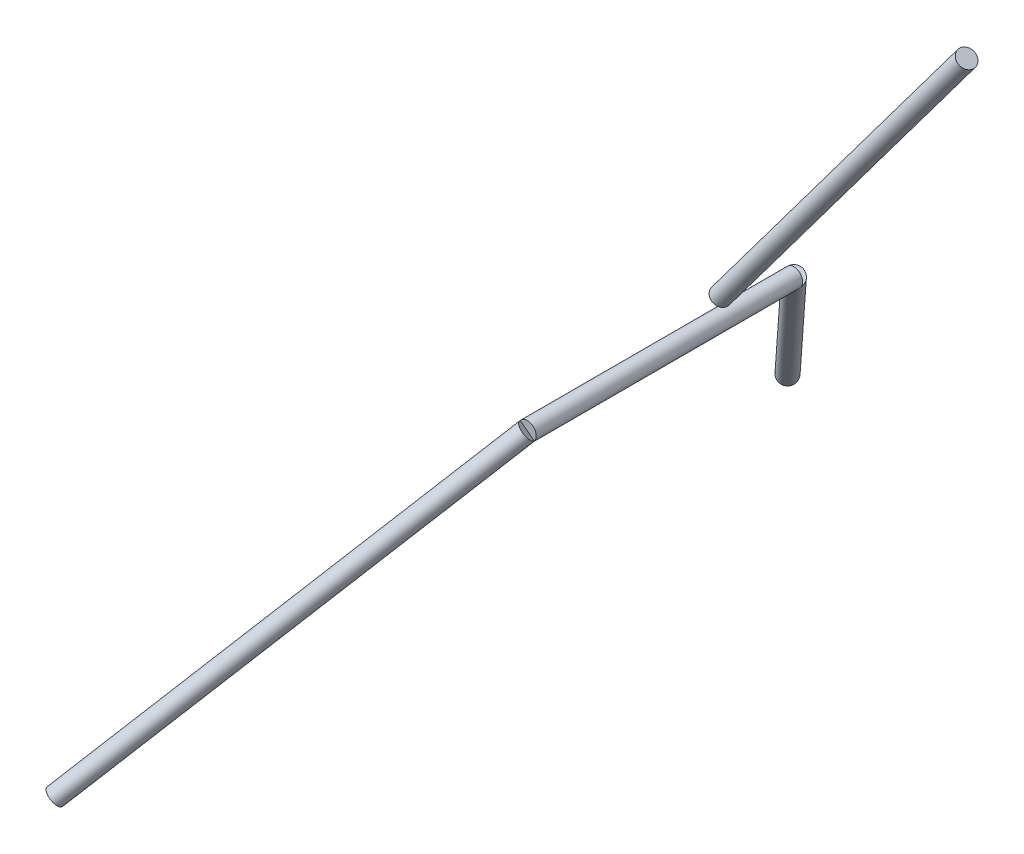
ISO-10303-21;
HEADER;
FILE_DESCRIPTION(('STEP AP214'),'2;1');
FILE_NAME('part.step','',(''),(''),'','','');
FILE_SCHEMA(('AUTOMOTIVE_DESIGN { 1 0 10303 214 1 1 1 1 }'));
ENDSEC;
DATA;
#1=APPLICATION_CONTEXT('core data for automotive mechanical design processes');
#2=APPLICATION_PROTOCOL_DEFINITION('international standard','automotive_design',2000,#1);
#3=PRODUCT_CONTEXT('',#1,'mechanical');
#4=PRODUCT('Part','Part','',(#3));
#5=PRODUCT_RELATED_PRODUCT_CATEGORY('part','',(#4));
#6=PRODUCT_DEFINITION_FORMATION('','',#4);
#7=PRODUCT_DEFINITION_CONTEXT('part definition',#1,'design');
#8=PRODUCT_DEFINITION('design','',#6,#7);
#9=PRODUCT_DEFINITION_SHAPE('','',#8);
#10=(LENGTH_UNIT() NAMED_UNIT(*) SI_UNIT(.MILLI.,.METRE.));
#11=(NAMED_UNIT(*) PLANE_ANGLE_UNIT() SI_UNIT($,.RADIAN.));
#12=(NAMED_UNIT(*) SI_UNIT($,.STERADIAN.) SOLID_ANGLE_UNIT());
#13=UNCERTAINTY_MEASURE_WITH_UNIT(LENGTH_MEASURE(1.E-05),#10,'distance_accuracy_value','');
#14=(GEOMETRIC_REPRESENTATION_CONTEXT(3) GLOBAL_UNCERTAINTY_ASSIGNED_CONTEXT((#13)) GLOBAL_UNIT_ASSIGNED_CONTEXT((#10,
#11,#12)) REPRESENTATION_CONTEXT('',''));
#15=CARTESIAN_POINT('',(0.,0.,0.));
#16=DIRECTION('',(0.,0.,1.));
#17=DIRECTION('',(1.,0.,0.));
#18=AXIS2_PLACEMENT_3D('',#15,#16,#17);
#19=CARTESIAN_POINT('',(-192.431415217252,410.982106119945,0.));
#20=DIRECTION('',(0.599126640950296,0.800654275017385,0.));
#21=DIRECTION('',(-0.800654275017385,0.599126640950296,0.));
#22=AXIS2_PLACEMENT_3D('',#19,#20,#21);
#23=PLANE('',#22);
#24=CARTESIAN_POINT('',(-192.431415217252,410.982106119945,0.));
#25=DIRECTION('',(0.599126640950296,0.800654275017385,0.));
#26=DIRECTION('',(-0.800654275017385,0.599126640950296,0.));
#27=AXIS2_PLACEMENT_3D('',#24,#25,#26);
#28=CIRCLE('',#27,0.800000000000014);
#29=CARTESIAN_POINT('',(-193.071938637266,411.461407432706,0.));
#30=VERTEX_POINT('',#29);
#31=EDGE_CURVE('E73',#30,#30,#28,.T.);
#32=ORIENTED_EDGE('',*,*,#31,.F.);
#33=EDGE_LOOP('',(#32));
#34=FACE_BOUND('',#33,.T.);
#35=ADVANCED_FACE('F67',(#34),#23,.F.);
#36=CARTESIAN_POINT('',(-170.263729502091,440.606314295589,0.));
#37=DIRECTION('',(0.599126640950296,0.800654275017385,0.));
#38=DIRECTION('',(-0.800654275017385,0.599126640950296,0.));
#39=AXIS2_PLACEMENT_3D('',#36,#37,#38);
#40=PLANE('',#39);
#41=CARTESIAN_POINT('',(-170.263729502091,440.606314295589,0.));
#42=DIRECTION('',(0.599126640950296,0.800654275017385,0.));
#43=DIRECTION('',(-0.800654275017385,0.599126640950296,0.));
#44=AXIS2_PLACEMENT_3D('',#41,#42,#43);
#45=CIRCLE('',#44,0.800000000000014);
#46=CARTESIAN_POINT('',(-170.904252922105,441.085615608349,0.));
#47=VERTEX_POINT('',#46);
#48=EDGE_CURVE('E12',#47,#47,#45,.T.);
#49=ORIENTED_EDGE('',*,*,#48,.T.);
#50=EDGE_LOOP('',(#49));
#51=FACE_BOUND('',#50,.T.);
#52=ADVANCED_FACE('F82',(#51),#40,.T.);
#53=CARTESIAN_POINT('',(-192.431415217252,410.982106119945,0.));
#54=DIRECTION('',(0.599126640950297,0.800654275017384,0.));
#55=DIRECTION('',(-0.800654275017384,0.599126640950297,0.));
#56=AXIS2_PLACEMENT_3D('',#53,#54,#55);
#57=CYLINDRICAL_SURFACE('',#56,0.800000000000014);
#58=ORIENTED_EDGE('',*,*,#48,.F.);
#59=EDGE_LOOP('',(#58));
#60=FACE_BOUND('',#59,.T.);
#61=ORIENTED_EDGE('',*,*,#31,.T.);
#62=EDGE_LOOP('',(#61));
#63=FACE_BOUND('',#62,.T.);
#64=ADVANCED_FACE('F79',(#60,#63),#57,.T.);
#65=CLOSED_SHELL('',(#35,#52,#64));
#66=MANIFOLD_SOLID_BREP('B2',#65);
#67=CARTESIAN_POINT('',(-197.823554985804,403.776217644789,12.));
#68=DIRECTION('',(0.,0.,1.));
#69=DIRECTION('',(1.,0.,0.));
#70=AXIS2_PLACEMENT_3D('',#67,#68,#69);
#71=PLANE('',#70);
#72=CARTESIAN_POINT('',(-197.823554985804,403.776217644789,12.));
#73=DIRECTION('',(0.,0.,1.));
#74=DIRECTION('',(1.,0.,0.));
#75=AXIS2_PLACEMENT_3D('',#72,#73,#74);
#76=CIRCLE('',#75,0.799999999999995);
#77=CARTESIAN_POINT('',(-197.183031565791,403.296916332029,11.9999999999999));
#78=VERTEX_POINT('',#77);
#79=CARTESIAN_POINT('',(-198.464078405818,404.255518957549,12.));
#80=VERTEX_POINT('',#79);
#81=EDGE_CURVE('E131',#78,#80,#76,.T.);
#82=ORIENTED_EDGE('',*,*,#81,.T.);
#83=DIRECTION('',(0.800654275017383,-0.599126640950299,0.));
#84=VECTOR('',#83,1.);
#85=CARTESIAN_POINT('',(-197.823554985804,403.776217644789,12.));
#86=LINE('',#85,#84);
#87=EDGE_CURVE('E140',#80,#78,#86,.T.);
#88=ORIENTED_EDGE('',*,*,#87,.T.);
#89=EDGE_LOOP('',(#82,#88));
#90=FACE_BOUND('',#89,.T.);
#91=ADVANCED_FACE('F108',(#90),#71,.T.);
#92=CARTESIAN_POINT('',(-197.823554985804,403.776217644789,-11.9999999999999));
#93=DIRECTION('',(0.517512951419017,0.69158826967415,0.503871025524086));
#94=DIRECTION('',(-0.800654275017386,0.599126640950295,0.));
#95=AXIS2_PLACEMENT_3D('',#92,#93,#94);
#96=PLANE('',#95);
#97=CARTESIAN_POINT('',(-197.823554985804,403.776217644789,-11.9999999999999));
#98=DIRECTION('',(0.517512951419017,0.69158826967415,0.503871025524086));
#99=DIRECTION('',(-0.800654275017386,0.599126640950295,0.));
#100=AXIS2_PLACEMENT_3D('',#97,#98,#99);
#101=CIRCLE('',#100,0.80000000000002);
#102=CARTESIAN_POINT('',(-197.183031565791,403.296916332029,-12.));
#103=VERTEX_POINT('',#102);
#104=CARTESIAN_POINT('',(-198.464078405818,404.255518957549,-12.));
#105=VERTEX_POINT('',#104);
#106=EDGE_CURVE('E161',#103,#105,#101,.T.);
#107=ORIENTED_EDGE('',*,*,#106,.T.);
#108=DIRECTION('',(0.800654275017386,-0.599126640950295,0.));
#109=VECTOR('',#108,1.);
#110=CARTESIAN_POINT('',(-197.823554985804,403.776217644789,-11.9999999999999));
#111=LINE('',#110,#109);
#112=EDGE_CURVE('E137',#105,#103,#111,.T.);
#113=ORIENTED_EDGE('',*,*,#112,.T.);
#114=EDGE_LOOP('',(#107,#113));
#115=FACE_BOUND('',#114,.T.);
#116=ADVANCED_FACE('F167',(#115),#96,.T.);
#117=CARTESIAN_POINT('',(-219.392114060015,374.952663744163,-33.));
#118=DIRECTION('',(0.517512951419017,0.69158826967415,0.503871025524086));
#119=DIRECTION('',(-0.800654275017386,0.599126640950295,0.));
#120=AXIS2_PLACEMENT_3D('',#117,#118,#119);
#121=PLANE('',#120);
#122=CARTESIAN_POINT('',(-219.392114060015,374.952663744163,-33.));
#123=DIRECTION('',(0.517512951419017,0.69158826967415,0.503871025524086));
#124=DIRECTION('',(-0.800654275017386,0.599126640950295,0.));
#125=AXIS2_PLACEMENT_3D('',#122,#123,#124);
#126=CIRCLE('',#125,0.80000000000002);
#127=CARTESIAN_POINT('',(-220.032637480029,375.431965056923,-33.));
#128=VERTEX_POINT('',#127);
#129=EDGE_CURVE('E158',#128,#128,#126,.T.);
#130=ORIENTED_EDGE('',*,*,#129,.F.);
#131=EDGE_LOOP('',(#130));
#132=FACE_BOUND('',#131,.T.);
#133=ADVANCED_FACE('F110',(#132),#121,.F.);
#134=CARTESIAN_POINT('',(-219.392114060015,374.952663744163,-33.));
#135=DIRECTION('',(0.517512951419018,0.691588269674149,0.503871025524086));
#136=DIRECTION('',(-0.800654275017385,0.599126640950296,0.));
#137=AXIS2_PLACEMENT_3D('',#134,#135,#136);
#138=CYLINDRICAL_SURFACE('',#137,0.80000000000002);
#139=CARTESIAN_POINT('',(-197.823554985804,403.776217644789,-11.9999999999999));
#140=DIRECTION('',(0.298401450030895,0.398774449855324,0.867142152569025));
#141=DIRECTION('',(0.51952796509509,0.694281071502168,-0.498060726456079));
#142=AXIS2_PLACEMENT_3D('',#139,#140,#141);
#143=ELLIPSE('',#142,0.922570766084776,0.800000000000008);
#144=EDGE_CURVE('E116',#105,#103,#143,.T.);
#145=ORIENTED_EDGE('',*,*,#144,.F.);
#146=ORIENTED_EDGE('',*,*,#106,.F.);
#147=EDGE_LOOP('',(#145,#146));
#148=FACE_BOUND('',#147,.T.);
#149=ORIENTED_EDGE('',*,*,#129,.T.);
#150=EDGE_LOOP('',(#149));
#151=FACE_BOUND('',#150,.T.);
#152=ADVANCED_FACE('F168',(#148,#151),#138,.T.);
#153=CARTESIAN_POINT('',(-197.823554985804,403.776217644789,-12.));
#154=DIRECTION('',(0.,0.,1.));
#155=DIRECTION('',(1.,0.,0.));
#156=AXIS2_PLACEMENT_3D('',#153,#154,#155);
#157=PLANE('',#156);
#158=ORIENTED_EDGE('',*,*,#112,.F.);
#159=CARTESIAN_POINT('',(-197.823554985804,403.776217644789,-12.));
#160=DIRECTION('',(0.,0.,1.));
#161=DIRECTION('',(1.,0.,0.));
#162=AXIS2_PLACEMENT_3D('',#159,#160,#161);
#163=CIRCLE('',#162,0.799999999999995);
#164=EDGE_CURVE('E138',#103,#105,#163,.T.);
#165=ORIENTED_EDGE('',*,*,#164,.F.);
#166=EDGE_LOOP('',(#158,#165));
#167=FACE_BOUND('',#166,.T.);
#168=ADVANCED_FACE('F165',(#167),#157,.F.);
#169=CARTESIAN_POINT('',(-197.823554985804,403.776217644789,-12.));
#170=DIRECTION('',(0.,0.,1.));
#171=DIRECTION('',(1.,0.,0.));
#172=AXIS2_PLACEMENT_3D('',#169,#170,#171);
#173=CYLINDRICAL_SURFACE('',#172,0.799999999999995);
#174=CARTESIAN_POINT('',(-197.823554985804,403.776217644789,12.));
#175=DIRECTION('',(-0.298401450030895,-0.398774449855324,0.867142152569025));
#176=DIRECTION('',(0.51952796509509,0.694281071502168,0.498060726456079));
#177=AXIS2_PLACEMENT_3D('',#174,#175,#176);
#178=ELLIPSE('',#177,0.922570766084777,0.800000000000008);
#179=EDGE_CURVE('E65',#80,#78,#178,.T.);
#180=ORIENTED_EDGE('',*,*,#179,.F.);
#181=ORIENTED_EDGE('',*,*,#81,.F.);
#182=EDGE_LOOP('',(#180,#181));
#183=FACE_BOUND('',#182,.T.);
#184=ORIENTED_EDGE('',*,*,#164,.T.);
#185=ORIENTED_EDGE('',*,*,#144,.T.);
#186=EDGE_LOOP('',(#184,#185));
#187=FACE_BOUND('',#186,.T.);
#188=ADVANCED_FACE('F133',(#183,#187),#173,.T.);
#189=CARTESIAN_POINT('',(-197.823554985804,403.776217644789,12.));
#190=DIRECTION('',(-0.51751295141902,-0.691588269674147,0.503871025524087));
#191=DIRECTION('',(0.800654275017383,-0.599126640950299,0.));
#192=AXIS2_PLACEMENT_3D('',#189,#190,#191);
#193=PLANE('',#192);
#194=ORIENTED_EDGE('',*,*,#87,.F.);
#195=CARTESIAN_POINT('',(-197.823554985804,403.776217644789,12.));
#196=DIRECTION('',(-0.51751295141902,-0.691588269674147,0.503871025524087));
#197=DIRECTION('',(0.800654275017383,-0.599126640950299,0.));
#198=AXIS2_PLACEMENT_3D('',#195,#196,#197);
#199=CIRCLE('',#198,0.800000000000022);
#200=EDGE_CURVE('E148',#78,#80,#199,.T.);
#201=ORIENTED_EDGE('',*,*,#200,.F.);
#202=EDGE_LOOP('',(#194,#201));
#203=FACE_BOUND('',#202,.T.);
#204=ADVANCED_FACE('F149',(#203),#193,.F.);
#205=CARTESIAN_POINT('',(-219.392114060015,374.952663744163,33.));
#206=DIRECTION('',(-0.51751295141902,-0.691588269674147,0.503871025524087));
#207=DIRECTION('',(0.800654275017383,-0.599126640950299,0.));
#208=AXIS2_PLACEMENT_3D('',#205,#206,#207);
#209=PLANE('',#208);
#210=CARTESIAN_POINT('',(-219.392114060015,374.952663744163,33.));
#211=DIRECTION('',(-0.51751295141902,-0.691588269674147,0.503871025524087));
#212=DIRECTION('',(0.800654275017383,-0.599126640950299,0.));
#213=AXIS2_PLACEMENT_3D('',#210,#211,#212);
#214=CIRCLE('',#213,0.800000000000022);
#215=CARTESIAN_POINT('',(-218.751590640001,374.473362431403,33.));
#216=VERTEX_POINT('',#215);
#217=EDGE_CURVE('E144',#216,#216,#214,.T.);
#218=ORIENTED_EDGE('',*,*,#217,.T.);
#219=EDGE_LOOP('',(#218));
#220=FACE_BOUND('',#219,.T.);
#221=ADVANCED_FACE('F190',(#220),#209,.T.);
#222=CARTESIAN_POINT('',(-197.823554985804,403.776217644789,12.));
#223=DIRECTION('',(-0.517512951419018,-0.691588269674149,0.503871025524086));
#224=DIRECTION('',(0.800654275017385,-0.599126640950296,0.));
#225=AXIS2_PLACEMENT_3D('',#222,#223,#224);
#226=CYLINDRICAL_SURFACE('',#225,0.800000000000022);
#227=ORIENTED_EDGE('',*,*,#217,.F.);
#228=EDGE_LOOP('',(#227));
#229=FACE_BOUND('',#228,.T.);
#230=ORIENTED_EDGE('',*,*,#200,.T.);
#231=ORIENTED_EDGE('',*,*,#179,.T.);
#232=EDGE_LOOP('',(#230,#231));
#233=FACE_BOUND('',#232,.T.);
#234=ADVANCED_FACE('F147',(#229,#233),#226,.T.);
#235=CLOSED_SHELL('',(#91,#116,#133,#152,#168,#188,#204,#221,#234));
#236=MANIFOLD_SOLID_BREP('B7',#235);
#237=ADVANCED_BREP_SHAPE_REPRESENTATION('',(#18,#66,#236),#14);
#238=SHAPE_DEFINITION_REPRESENTATION(#9,#237);
ENDSEC;
END-ISO-10303-21;
